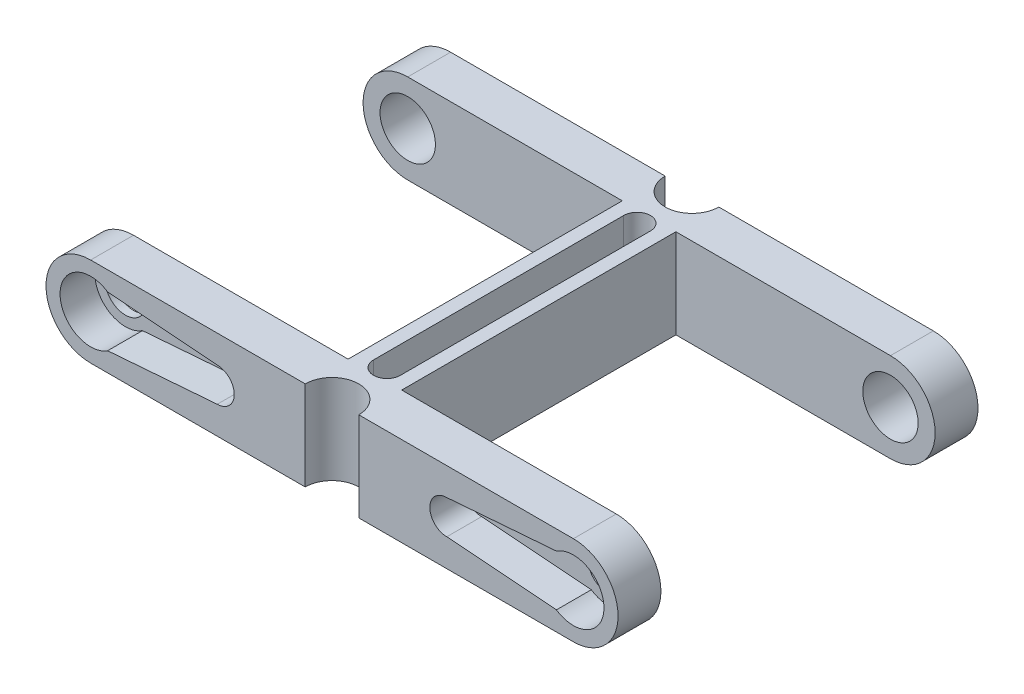
ISO-10303-21;
HEADER;
FILE_DESCRIPTION(('STEP AP214'),'2;1');
FILE_NAME('part.step','',(''),(''),'','','');
FILE_SCHEMA(('AUTOMOTIVE_DESIGN { 1 0 10303 214 1 1 1 1 }'));
ENDSEC;
DATA;
#1=APPLICATION_CONTEXT('core data for automotive mechanical design processes');
#2=APPLICATION_PROTOCOL_DEFINITION('international standard','automotive_design',2000,#1);
#3=PRODUCT_CONTEXT('',#1,'mechanical');
#4=PRODUCT('Part','Part','',(#3));
#5=PRODUCT_RELATED_PRODUCT_CATEGORY('part','',(#4));
#6=PRODUCT_DEFINITION_FORMATION('','',#4);
#7=PRODUCT_DEFINITION_CONTEXT('part definition',#1,'design');
#8=PRODUCT_DEFINITION('design','',#6,#7);
#9=PRODUCT_DEFINITION_SHAPE('','',#8);
#10=(LENGTH_UNIT() NAMED_UNIT(*) SI_UNIT(.MILLI.,.METRE.));
#11=(NAMED_UNIT(*) PLANE_ANGLE_UNIT() SI_UNIT($,.RADIAN.));
#12=(NAMED_UNIT(*) SI_UNIT($,.STERADIAN.) SOLID_ANGLE_UNIT());
#13=UNCERTAINTY_MEASURE_WITH_UNIT(LENGTH_MEASURE(1.E-05),#10,'distance_accuracy_value','');
#14=(GEOMETRIC_REPRESENTATION_CONTEXT(3) GLOBAL_UNCERTAINTY_ASSIGNED_CONTEXT((#13)) GLOBAL_UNIT_ASSIGNED_CONTEXT((#10,
#11,#12)) REPRESENTATION_CONTEXT('',''));
#15=CARTESIAN_POINT('',(0.,0.,0.));
#16=DIRECTION('',(0.,0.,1.));
#17=DIRECTION('',(1.,0.,0.));
#18=AXIS2_PLACEMENT_3D('',#15,#16,#17);
#19=CARTESIAN_POINT('',(-27.0232558139535,0.,20.15));
#20=DIRECTION('',(0.,0.,-1.));
#21=DIRECTION('',(-1.,0.,0.));
#22=AXIS2_PLACEMENT_3D('',#19,#20,#21);
#23=CYLINDRICAL_SURFACE('',#22,5.00000000000002);
#24=DIRECTION('',(0.,0.,-1.));
#25=VECTOR('',#24,1.);
#26=CARTESIAN_POINT('',(-27.0232558139535,5.00000000000001,20.15));
#27=LINE('',#26,#25);
#28=CARTESIAN_POINT('',(-27.0232558139535,5.00000000000001,20.15));
#29=VERTEX_POINT('',#28);
#30=CARTESIAN_POINT('',(-27.0232558139535,5.00000000000001,15.35));
#31=VERTEX_POINT('',#30);
#32=EDGE_CURVE('E459',#29,#31,#27,.T.);
#33=ORIENTED_EDGE('',*,*,#32,.T.);
#34=CARTESIAN_POINT('',(-27.0232558139535,0.,15.35));
#35=DIRECTION('',(0.,0.,1.));
#36=DIRECTION('',(1.,0.,0.));
#37=AXIS2_PLACEMENT_3D('',#34,#35,#36);
#38=CIRCLE('',#37,5.00000000000002);
#39=CARTESIAN_POINT('',(-27.0232558139535,-5.00000000000004,15.35));
#40=VERTEX_POINT('',#39);
#41=EDGE_CURVE('E419',#31,#40,#38,.T.);
#42=ORIENTED_EDGE('',*,*,#41,.T.);
#43=DIRECTION('',(0.,0.,-1.));
#44=VECTOR('',#43,1.);
#45=CARTESIAN_POINT('',(-27.0232558139535,-5.00000000000002,20.15));
#46=LINE('',#45,#44);
#47=CARTESIAN_POINT('',(-27.0232558139535,-5.00000000000002,20.15));
#48=VERTEX_POINT('',#47);
#49=EDGE_CURVE('E474',#48,#40,#46,.T.);
#50=ORIENTED_EDGE('',*,*,#49,.F.);
#51=CARTESIAN_POINT('',(-27.0232558139535,0.,20.15));
#52=DIRECTION('',(0.,0.,1.));
#53=DIRECTION('',(1.,0.,0.));
#54=AXIS2_PLACEMENT_3D('',#51,#52,#53);
#55=CIRCLE('',#54,5.00000000000002);
#56=EDGE_CURVE('E424',#29,#48,#55,.T.);
#57=ORIENTED_EDGE('',*,*,#56,.F.);
#58=EDGE_LOOP('',(#33,#42,#50,#57));
#59=FACE_BOUND('',#58,.T.);
#60=ADVANCED_FACE('F39',(#59),#23,.T.);
#61=CARTESIAN_POINT('',(27.0232558139535,0.,20.15));
#62=DIRECTION('',(0.,0.,-1.));
#63=DIRECTION('',(-1.,0.,0.));
#64=AXIS2_PLACEMENT_3D('',#61,#62,#63);
#65=CYLINDRICAL_SURFACE('',#64,5.00000000000002);
#66=DIRECTION('',(0.,0.,-1.));
#67=VECTOR('',#66,1.);
#68=CARTESIAN_POINT('',(27.0232558139535,5.00000000000002,20.15));
#69=LINE('',#68,#67);
#70=CARTESIAN_POINT('',(27.0232558139535,5.00000000000002,-15.35));
#71=VERTEX_POINT('',#70);
#72=CARTESIAN_POINT('',(27.0232558139535,5.00000000000002,-20.15));
#73=VERTEX_POINT('',#72);
#74=EDGE_CURVE('E463',#71,#73,#69,.T.);
#75=ORIENTED_EDGE('',*,*,#74,.F.);
#76=CARTESIAN_POINT('',(27.0232558139535,0.,-15.35));
#77=DIRECTION('',(0.,0.,-1.));
#78=DIRECTION('',(-1.,0.,0.));
#79=AXIS2_PLACEMENT_3D('',#76,#77,#78);
#80=CIRCLE('',#79,5.00000000000002);
#81=CARTESIAN_POINT('',(27.0232558139535,-5.00000000000003,-15.35));
#82=VERTEX_POINT('',#81);
#83=EDGE_CURVE('E411',#71,#82,#80,.T.);
#84=ORIENTED_EDGE('',*,*,#83,.T.);
#85=DIRECTION('',(0.,0.,-1.));
#86=VECTOR('',#85,1.);
#87=CARTESIAN_POINT('',(27.0232558139535,-5.00000000000002,20.15));
#88=LINE('',#87,#86);
#89=CARTESIAN_POINT('',(27.0232558139535,-5.00000000000002,-20.15));
#90=VERTEX_POINT('',#89);
#91=EDGE_CURVE('E468',#82,#90,#88,.T.);
#92=ORIENTED_EDGE('',*,*,#91,.T.);
#93=CARTESIAN_POINT('',(27.0232558139535,0.,-20.15));
#94=DIRECTION('',(0.,0.,1.));
#95=DIRECTION('',(1.,0.,0.));
#96=AXIS2_PLACEMENT_3D('',#93,#94,#95);
#97=CIRCLE('',#96,5.00000000000002);
#98=EDGE_CURVE('E451',#90,#73,#97,.T.);
#99=ORIENTED_EDGE('',*,*,#98,.T.);
#100=EDGE_LOOP('',(#75,#84,#92,#99));
#101=FACE_BOUND('',#100,.T.);
#102=ADVANCED_FACE('F550',(#101),#65,.T.);
#103=CARTESIAN_POINT('',(-27.0232558139535,0.,20.15));
#104=DIRECTION('',(0.,0.,1.));
#105=DIRECTION('',(1.,0.,0.));
#106=AXIS2_PLACEMENT_3D('',#103,#104,#105);
#107=PLANE('',#106);
#108=CARTESIAN_POINT('',(12.8482558139535,0.,20.15));
#109=DIRECTION('',(0.,0.,1.));
#110=DIRECTION('',(1.,0.,0.));
#111=AXIS2_PLACEMENT_3D('',#108,#109,#110);
#112=CIRCLE('',#111,1.9);
#113=CARTESIAN_POINT('',(12.8482558139535,1.9,20.15));
#114=VERTEX_POINT('',#113);
#115=CARTESIAN_POINT('',(12.8482558139535,-1.9,20.15));
#116=VERTEX_POINT('',#115);
#117=EDGE_CURVE('E57',#114,#116,#112,.T.);
#118=ORIENTED_EDGE('',*,*,#117,.F.);
#119=DIRECTION('',(-0.997018781415782,-0.0771592476906667,0.));
#120=VECTOR('',#119,1.);
#121=CARTESIAN_POINT('',(25.1237492990923,2.85,20.15));
#122=LINE('',#121,#120);
#123=CARTESIAN_POINT('',(25.1237492990923,2.85,20.15));
#124=VERTEX_POINT('',#123);
#125=EDGE_CURVE('E250',#124,#114,#122,.T.);
#126=ORIENTED_EDGE('',*,*,#125,.F.);
#127=CARTESIAN_POINT('',(27.0232558139535,0.,20.15));
#128=DIRECTION('',(0.,0.,1.));
#129=DIRECTION('',(1.,0.,0.));
#130=AXIS2_PLACEMENT_3D('',#127,#128,#129);
#131=CIRCLE('',#130,3.425);
#132=CARTESIAN_POINT('',(25.1237492990923,-2.85,20.15));
#133=VERTEX_POINT('',#132);
#134=EDGE_CURVE('E254',#133,#124,#131,.T.);
#135=ORIENTED_EDGE('',*,*,#134,.F.);
#136=DIRECTION('',(0.997018781415782,-0.0771592476906667,0.));
#137=VECTOR('',#136,1.);
#138=CARTESIAN_POINT('',(12.8482558139535,-1.9,20.15));
#139=LINE('',#138,#137);
#140=EDGE_CURVE('E266',#116,#133,#139,.T.);
#141=ORIENTED_EDGE('',*,*,#140,.F.);
#142=EDGE_LOOP('',(#118,#126,#135,#141));
#143=FACE_BOUND('',#142,.T.);
#144=DIRECTION('',(0.,1.,0.));
#145=VECTOR('',#144,1.);
#146=CARTESIAN_POINT('',(3.,-5.00000000000003,20.15));
#147=LINE('',#146,#145);
#148=CARTESIAN_POINT('',(3.,-5.00000000000003,20.15));
#149=VERTEX_POINT('',#148);
#150=CARTESIAN_POINT('',(3.,5.00000000000001,20.15));
#151=VERTEX_POINT('',#150);
#152=EDGE_CURVE('E489',#149,#151,#147,.T.);
#153=ORIENTED_EDGE('',*,*,#152,.F.);
#154=DIRECTION('',(1.,0.,0.));
#155=VECTOR('',#154,1.);
#156=CARTESIAN_POINT('',(-27.0232558139535,-5.00000000000002,20.15));
#157=LINE('',#156,#155);
#158=CARTESIAN_POINT('',(27.0232558139535,-5.00000000000002,20.15));
#159=VERTEX_POINT('',#158);
#160=EDGE_CURVE('E428',#149,#159,#157,.T.);
#161=ORIENTED_EDGE('',*,*,#160,.T.);
#162=CARTESIAN_POINT('',(27.0232558139535,0.,20.15));
#163=DIRECTION('',(0.,0.,1.));
#164=DIRECTION('',(1.,0.,0.));
#165=AXIS2_PLACEMENT_3D('',#162,#163,#164);
#166=CIRCLE('',#165,5.00000000000002);
#167=CARTESIAN_POINT('',(27.0232558139535,5.00000000000002,20.15));
#168=VERTEX_POINT('',#167);
#169=EDGE_CURVE('E434',#159,#168,#166,.T.);
#170=ORIENTED_EDGE('',*,*,#169,.T.);
#171=DIRECTION('',(-1.,0.,0.));
#172=VECTOR('',#171,1.);
#173=CARTESIAN_POINT('',(-27.0232558139535,5.00000000000001,20.15));
#174=LINE('',#173,#172);
#175=EDGE_CURVE('E438',#168,#151,#174,.T.);
#176=ORIENTED_EDGE('',*,*,#175,.T.);
#177=EDGE_LOOP('',(#153,#161,#170,#176));
#178=FACE_BOUND('',#177,.T.);
#179=ADVANCED_FACE('F558',(#143,#178),#107,.T.);
#180=CARTESIAN_POINT('',(-27.0232558139535,0.,-20.15));
#181=DIRECTION('',(0.,0.,1.));
#182=DIRECTION('',(1.,0.,0.));
#183=AXIS2_PLACEMENT_3D('',#180,#181,#182);
#184=PLANE('',#183);
#185=CARTESIAN_POINT('',(27.0232558139535,0.,-20.15));
#186=DIRECTION('',(0.,0.,-1.));
#187=DIRECTION('',(-1.,0.,0.));
#188=AXIS2_PLACEMENT_3D('',#185,#186,#187);
#189=CIRCLE('',#188,3.1);
#190=CARTESIAN_POINT('',(23.9232558139535,0.,-20.15));
#191=VERTEX_POINT('',#190);
#192=EDGE_CURVE('E946',#191,#191,#189,.T.);
#193=ORIENTED_EDGE('',*,*,#192,.F.);
#194=EDGE_LOOP('',(#193));
#195=FACE_BOUND('',#194,.T.);
#196=DIRECTION('',(1.,0.,0.));
#197=VECTOR('',#196,1.);
#198=CARTESIAN_POINT('',(-27.0232558139535,-5.00000000000002,-20.15));
#199=LINE('',#198,#197);
#200=CARTESIAN_POINT('',(3.,-5.00000000000003,-20.15));
#201=VERTEX_POINT('',#200);
#202=EDGE_CURVE('E446',#201,#90,#199,.T.);
#203=ORIENTED_EDGE('',*,*,#202,.F.);
#204=DIRECTION('',(0.,1.,0.));
#205=VECTOR('',#204,1.);
#206=CARTESIAN_POINT('',(3.,-5.00000000000003,-20.15));
#207=LINE('',#206,#205);
#208=CARTESIAN_POINT('',(3.,5.00000000000001,-20.15));
#209=VERTEX_POINT('',#208);
#210=EDGE_CURVE('E482',#201,#209,#207,.T.);
#211=ORIENTED_EDGE('',*,*,#210,.T.);
#212=DIRECTION('',(-1.,0.,0.));
#213=VECTOR('',#212,1.);
#214=CARTESIAN_POINT('',(-27.0232558139535,5.00000000000001,-20.15));
#215=LINE('',#214,#213);
#216=EDGE_CURVE('E429',#73,#209,#215,.T.);
#217=ORIENTED_EDGE('',*,*,#216,.F.);
#218=ORIENTED_EDGE('',*,*,#98,.F.);
#219=EDGE_LOOP('',(#203,#211,#217,#218));
#220=FACE_BOUND('',#219,.T.);
#221=ADVANCED_FACE('F551',(#195,#220),#184,.F.);
#222=CARTESIAN_POINT('',(-27.0232558139535,-5.00000000000004,-15.35));
#223=VERTEX_POINT('',#222);
#224=CARTESIAN_POINT('',(-27.0232558139535,-5.00000000000002,-20.15));
#225=VERTEX_POINT('',#224);
#226=EDGE_CURVE('E473',#223,#225,#46,.T.);
#227=ORIENTED_EDGE('',*,*,#226,.F.);
#228=CARTESIAN_POINT('',(-27.0232558139535,0.,-15.35));
#229=DIRECTION('',(0.,0.,-1.));
#230=DIRECTION('',(-1.,0.,0.));
#231=AXIS2_PLACEMENT_3D('',#228,#229,#230);
#232=CIRCLE('',#231,5.00000000000002);
#233=CARTESIAN_POINT('',(-27.0232558139535,5.00000000000001,-15.35));
#234=VERTEX_POINT('',#233);
#235=EDGE_CURVE('E415',#223,#234,#232,.T.);
#236=ORIENTED_EDGE('',*,*,#235,.T.);
#237=CARTESIAN_POINT('',(-27.0232558139535,5.00000000000001,-20.15));
#238=VERTEX_POINT('',#237);
#239=EDGE_CURVE('E442',#234,#238,#27,.T.);
#240=ORIENTED_EDGE('',*,*,#239,.T.);
#241=CARTESIAN_POINT('',(-27.0232558139535,0.,-20.15));
#242=DIRECTION('',(0.,0.,1.));
#243=DIRECTION('',(1.,0.,0.));
#244=AXIS2_PLACEMENT_3D('',#241,#242,#243);
#245=CIRCLE('',#244,5.00000000000002);
#246=EDGE_CURVE('E423',#238,#225,#245,.T.);
#247=ORIENTED_EDGE('',*,*,#246,.T.);
#248=EDGE_LOOP('',(#227,#236,#240,#247));
#249=FACE_BOUND('',#248,.T.);
#250=ADVANCED_FACE('F41',(#249),#23,.T.);
#251=CARTESIAN_POINT('',(-27.0232558139535,-5.00000000000002,20.15));
#252=DIRECTION('',(0.,1.,0.));
#253=DIRECTION('',(-1.,0.,0.));
#254=AXIS2_PLACEMENT_3D('',#251,#252,#253);
#255=PLANE('',#254);
#256=CARTESIAN_POINT('',(-3.,-5.00000000000002,-20.15));
#257=VERTEX_POINT('',#256);
#258=EDGE_CURVE('E447',#225,#257,#199,.T.);
#259=ORIENTED_EDGE('',*,*,#258,.T.);
#260=CARTESIAN_POINT('',(0.,-5.00000000000003,-20.15));
#261=DIRECTION('',(0.,1.,0.));
#262=DIRECTION('',(-1.,0.,0.));
#263=AXIS2_PLACEMENT_3D('',#260,#261,#262);
#264=CIRCLE('',#263,3.);
#265=EDGE_CURVE('E346',#257,#201,#264,.T.);
#266=ORIENTED_EDGE('',*,*,#265,.T.);
#267=ORIENTED_EDGE('',*,*,#202,.T.);
#268=ORIENTED_EDGE('',*,*,#91,.F.);
#269=DIRECTION('',(-1.,0.,0.));
#270=VECTOR('',#269,1.);
#271=CARTESIAN_POINT('',(27.0232558139535,-5.00000000000003,-15.35));
#272=LINE('',#271,#270);
#273=CARTESIAN_POINT('',(3.,-5.00000000000003,-15.35));
#274=VERTEX_POINT('',#273);
#275=EDGE_CURVE('E323',#82,#274,#272,.T.);
#276=ORIENTED_EDGE('',*,*,#275,.T.);
#277=DIRECTION('',(0.,0.,1.));
#278=VECTOR('',#277,1.);
#279=CARTESIAN_POINT('',(3.,-5.00000000000003,-15.35));
#280=LINE('',#279,#278);
#281=CARTESIAN_POINT('',(3.,-5.00000000000003,15.35));
#282=VERTEX_POINT('',#281);
#283=EDGE_CURVE('E327',#274,#282,#280,.T.);
#284=ORIENTED_EDGE('',*,*,#283,.T.);
#285=DIRECTION('',(1.,0.,0.));
#286=VECTOR('',#285,1.);
#287=CARTESIAN_POINT('',(3.,-5.00000000000003,15.35));
#288=LINE('',#287,#286);
#289=CARTESIAN_POINT('',(27.0232558139535,-5.00000000000003,15.35));
#290=VERTEX_POINT('',#289);
#291=EDGE_CURVE('E331',#282,#290,#288,.T.);
#292=ORIENTED_EDGE('',*,*,#291,.T.);
#293=EDGE_CURVE('E469',#159,#290,#88,.T.);
#294=ORIENTED_EDGE('',*,*,#293,.F.);
#295=ORIENTED_EDGE('',*,*,#160,.F.);
#296=CARTESIAN_POINT('',(0.,-5.00000000000003,20.15));
#297=DIRECTION('',(0.,1.,0.));
#298=DIRECTION('',(1.,0.,0.));
#299=AXIS2_PLACEMENT_3D('',#296,#297,#298);
#300=CIRCLE('',#299,3.);
#301=CARTESIAN_POINT('',(-3.,-5.00000000000003,20.15));
#302=VERTEX_POINT('',#301);
#303=EDGE_CURVE('E276',#149,#302,#300,.T.);
#304=ORIENTED_EDGE('',*,*,#303,.T.);
#305=EDGE_CURVE('E430',#48,#302,#157,.T.);
#306=ORIENTED_EDGE('',*,*,#305,.F.);
#307=ORIENTED_EDGE('',*,*,#49,.T.);
#308=DIRECTION('',(1.,0.,0.));
#309=VECTOR('',#308,1.);
#310=CARTESIAN_POINT('',(-2.99999999999999,-5.00000000000003,15.35));
#311=LINE('',#310,#309);
#312=CARTESIAN_POINT('',(-2.99999999999999,-5.00000000000003,15.35));
#313=VERTEX_POINT('',#312);
#314=EDGE_CURVE('E340',#40,#313,#311,.T.);
#315=ORIENTED_EDGE('',*,*,#314,.T.);
#316=DIRECTION('',(0.,0.,-1.));
#317=VECTOR('',#316,1.);
#318=CARTESIAN_POINT('',(-2.99999999999999,-5.00000000000003,-15.35));
#319=LINE('',#318,#317);
#320=CARTESIAN_POINT('',(-2.99999999999999,-5.00000000000003,-15.35));
#321=VERTEX_POINT('',#320);
#322=EDGE_CURVE('E355',#313,#321,#319,.T.);
#323=ORIENTED_EDGE('',*,*,#322,.T.);
#324=DIRECTION('',(-1.,0.,0.));
#325=VECTOR('',#324,1.);
#326=CARTESIAN_POINT('',(-27.0232558139535,-5.00000000000004,-15.35));
#327=LINE('',#326,#325);
#328=EDGE_CURVE('E359',#321,#223,#327,.T.);
#329=ORIENTED_EDGE('',*,*,#328,.T.);
#330=ORIENTED_EDGE('',*,*,#226,.T.);
#331=EDGE_LOOP('',(#259,#266,#267,#268,#276,#284,#292,#294,#295,#304,#306,#307,#315,#323,#329,#330));
#332=FACE_BOUND('',#331,.T.);
#333=DIRECTION('',(0.,0.,1.));
#334=VECTOR('',#333,1.);
#335=CARTESIAN_POINT('',(-1.5,-5.00000000000003,14.));
#336=LINE('',#335,#334);
#337=CARTESIAN_POINT('',(-1.5,-5.00000000000003,-14.));
#338=VERTEX_POINT('',#337);
#339=CARTESIAN_POINT('',(-1.5,-5.00000000000003,14.));
#340=VERTEX_POINT('',#339);
#341=EDGE_CURVE('E380',#338,#340,#336,.T.);
#342=ORIENTED_EDGE('',*,*,#341,.T.);
#343=CARTESIAN_POINT('',(0.,-5.00000000000003,14.));
#344=DIRECTION('',(0.,1.,0.));
#345=DIRECTION('',(-1.,0.,0.));
#346=AXIS2_PLACEMENT_3D('',#343,#344,#345);
#347=CIRCLE('',#346,1.5);
#348=CARTESIAN_POINT('',(1.5,-5.00000000000003,14.));
#349=VERTEX_POINT('',#348);
#350=EDGE_CURVE('E350',#340,#349,#347,.T.);
#351=ORIENTED_EDGE('',*,*,#350,.T.);
#352=DIRECTION('',(0.,0.,-1.));
#353=VECTOR('',#352,1.);
#354=CARTESIAN_POINT('',(1.5,-5.00000000000003,14.));
#355=LINE('',#354,#353);
#356=CARTESIAN_POINT('',(1.5,-5.00000000000002,-14.));
#357=VERTEX_POINT('',#356);
#358=EDGE_CURVE('E372',#349,#357,#355,.T.);
#359=ORIENTED_EDGE('',*,*,#358,.T.);
#360=CARTESIAN_POINT('',(0.,-5.00000000000003,-14.));
#361=DIRECTION('',(0.,1.,0.));
#362=DIRECTION('',(-1.,0.,0.));
#363=AXIS2_PLACEMENT_3D('',#360,#361,#362);
#364=CIRCLE('',#363,1.5);
#365=EDGE_CURVE('E376',#357,#338,#364,.T.);
#366=ORIENTED_EDGE('',*,*,#365,.T.);
#367=EDGE_LOOP('',(#342,#351,#359,#366));
#368=FACE_BOUND('',#367,.T.);
#369=ADVANCED_FACE('F540',(#332,#368),#255,.F.);
#370=ORIENTED_EDGE('',*,*,#293,.T.);
#371=CARTESIAN_POINT('',(27.0232558139535,0.,15.35));
#372=DIRECTION('',(0.,0.,1.));
#373=DIRECTION('',(1.,0.,0.));
#374=AXIS2_PLACEMENT_3D('',#371,#372,#373);
#375=CIRCLE('',#374,5.00000000000002);
#376=CARTESIAN_POINT('',(27.0232558139535,5.00000000000002,15.35));
#377=VERTEX_POINT('',#376);
#378=EDGE_CURVE('E407',#290,#377,#375,.T.);
#379=ORIENTED_EDGE('',*,*,#378,.T.);
#380=EDGE_CURVE('E464',#168,#377,#69,.T.);
#381=ORIENTED_EDGE('',*,*,#380,.F.);
#382=ORIENTED_EDGE('',*,*,#169,.F.);
#383=EDGE_LOOP('',(#370,#379,#381,#382));
#384=FACE_BOUND('',#383,.T.);
#385=ADVANCED_FACE('F542',(#384),#65,.T.);
#386=CARTESIAN_POINT('',(-27.0232558139535,5.00000000000001,20.15));
#387=DIRECTION('',(0.,-1.,0.));
#388=DIRECTION('',(1.,0.,0.));
#389=AXIS2_PLACEMENT_3D('',#386,#387,#388);
#390=PLANE('',#389);
#391=DIRECTION('',(0.,0.,1.));
#392=VECTOR('',#391,1.);
#393=CARTESIAN_POINT('',(1.49999999999999,5.00000000000001,20.15));
#394=LINE('',#393,#392);
#395=CARTESIAN_POINT('',(1.49999999999999,5.00000000000001,-14.));
#396=VERTEX_POINT('',#395);
#397=CARTESIAN_POINT('',(1.5,5.00000000000001,14.));
#398=VERTEX_POINT('',#397);
#399=EDGE_CURVE('E492',#396,#398,#394,.T.);
#400=ORIENTED_EDGE('',*,*,#399,.T.);
#401=CARTESIAN_POINT('',(0.,5.00000000000001,14.));
#402=DIRECTION('',(0.,1.,0.));
#403=DIRECTION('',(-1.,0.,0.));
#404=AXIS2_PLACEMENT_3D('',#401,#402,#403);
#405=CIRCLE('',#404,1.5);
#406=CARTESIAN_POINT('',(-1.5,5.00000000000001,14.));
#407=VERTEX_POINT('',#406);
#408=EDGE_CURVE('E43',#398,#407,#405,.F.);
#409=ORIENTED_EDGE('',*,*,#408,.T.);
#410=DIRECTION('',(0.,0.,1.));
#411=VECTOR('',#410,1.);
#412=CARTESIAN_POINT('',(-1.5,5.00000000000001,20.15));
#413=LINE('',#412,#411);
#414=CARTESIAN_POINT('',(-1.5,5.00000000000001,-14.));
#415=VERTEX_POINT('',#414);
#416=EDGE_CURVE('E518',#407,#415,#413,.F.);
#417=ORIENTED_EDGE('',*,*,#416,.T.);
#418=CARTESIAN_POINT('',(0.,5.00000000000001,-14.));
#419=DIRECTION('',(0.,1.,0.));
#420=DIRECTION('',(-1.,0.,0.));
#421=AXIS2_PLACEMENT_3D('',#418,#419,#420);
#422=CIRCLE('',#421,1.5);
#423=EDGE_CURVE('E515',#415,#396,#422,.F.);
#424=ORIENTED_EDGE('',*,*,#423,.T.);
#425=EDGE_LOOP('',(#400,#409,#417,#424));
#426=FACE_BOUND('',#425,.T.);
#427=ORIENTED_EDGE('',*,*,#216,.T.);
#428=CARTESIAN_POINT('',(0.,5.00000000000001,-20.15));
#429=DIRECTION('',(0.,-1.,0.));
#430=DIRECTION('',(1.,0.,0.));
#431=AXIS2_PLACEMENT_3D('',#428,#429,#430);
#432=CIRCLE('',#431,3.);
#433=CARTESIAN_POINT('',(-3.,5.00000000000002,-20.15));
#434=VERTEX_POINT('',#433);
#435=EDGE_CURVE('E394',#209,#434,#432,.T.);
#436=ORIENTED_EDGE('',*,*,#435,.T.);
#437=EDGE_CURVE('E455',#434,#238,#215,.T.);
#438=ORIENTED_EDGE('',*,*,#437,.T.);
#439=ORIENTED_EDGE('',*,*,#239,.F.);
#440=DIRECTION('',(1.,0.,0.));
#441=VECTOR('',#440,1.);
#442=CARTESIAN_POINT('',(-27.0232558139535,5.00000000000001,-15.35));
#443=LINE('',#442,#441);
#444=CARTESIAN_POINT('',(-3.,5.00000000000001,-15.35));
#445=VERTEX_POINT('',#444);
#446=EDGE_CURVE('E49',#234,#445,#443,.T.);
#447=ORIENTED_EDGE('',*,*,#446,.T.);
#448=DIRECTION('',(0.,0.,1.));
#449=VECTOR('',#448,1.);
#450=CARTESIAN_POINT('',(-3.,5.00000000000001,20.15));
#451=LINE('',#450,#449);
#452=CARTESIAN_POINT('',(-3.,5.00000000000001,15.35));
#453=VERTEX_POINT('',#452);
#454=EDGE_CURVE('E505',#445,#453,#451,.T.);
#455=ORIENTED_EDGE('',*,*,#454,.T.);
#456=DIRECTION('',(-1.,0.,0.));
#457=VECTOR('',#456,1.);
#458=CARTESIAN_POINT('',(-27.0232558139535,5.00000000000001,15.35));
#459=LINE('',#458,#457);
#460=EDGE_CURVE('E11',#453,#31,#459,.T.);
#461=ORIENTED_EDGE('',*,*,#460,.T.);
#462=ORIENTED_EDGE('',*,*,#32,.F.);
#463=CARTESIAN_POINT('',(-3.,5.00000000000001,20.15));
#464=VERTEX_POINT('',#463);
#465=EDGE_CURVE('E437',#464,#29,#174,.T.);
#466=ORIENTED_EDGE('',*,*,#465,.F.);
#467=CARTESIAN_POINT('',(0.,5.00000000000001,20.15));
#468=DIRECTION('',(0.,-1.,0.));
#469=DIRECTION('',(1.,0.,0.));
#470=AXIS2_PLACEMENT_3D('',#467,#468,#469);
#471=CIRCLE('',#470,3.);
#472=EDGE_CURVE('E403',#464,#151,#471,.T.);
#473=ORIENTED_EDGE('',*,*,#472,.T.);
#474=ORIENTED_EDGE('',*,*,#175,.F.);
#475=ORIENTED_EDGE('',*,*,#380,.T.);
#476=DIRECTION('',(-1.,0.,0.));
#477=VECTOR('',#476,1.);
#478=CARTESIAN_POINT('',(-27.0232558139535,5.00000000000001,15.35));
#479=LINE('',#478,#477);
#480=CARTESIAN_POINT('',(2.99999999999999,5.00000000000001,15.35));
#481=VERTEX_POINT('',#480);
#482=EDGE_CURVE('E497',#377,#481,#479,.T.);
#483=ORIENTED_EDGE('',*,*,#482,.T.);
#484=DIRECTION('',(0.,0.,-1.));
#485=VECTOR('',#484,1.);
#486=CARTESIAN_POINT('',(2.99999999999999,5.00000000000001,20.15));
#487=LINE('',#486,#485);
#488=CARTESIAN_POINT('',(2.99999999999999,5.00000000000001,-15.35));
#489=VERTEX_POINT('',#488);
#490=EDGE_CURVE('E493',#481,#489,#487,.T.);
#491=ORIENTED_EDGE('',*,*,#490,.T.);
#492=DIRECTION('',(1.,0.,0.));
#493=VECTOR('',#492,1.);
#494=CARTESIAN_POINT('',(-27.0232558139535,5.00000000000001,-15.35));
#495=LINE('',#494,#493);
#496=EDGE_CURVE('E501',#489,#71,#495,.T.);
#497=ORIENTED_EDGE('',*,*,#496,.T.);
#498=ORIENTED_EDGE('',*,*,#74,.T.);
#499=EDGE_LOOP('',(#427,#436,#438,#439,#447,#455,#461,#462,#466,#473,#474,#475,#483,#491,#497,#498));
#500=FACE_BOUND('',#499,.T.);
#501=ADVANCED_FACE('F525',(#426,#500),#390,.F.);
#502=CARTESIAN_POINT('',(-12.8482558139535,0.,20.15));
#503=DIRECTION('',(0.,0.,1.));
#504=DIRECTION('',(-1.,0.,0.));
#505=AXIS2_PLACEMENT_3D('',#502,#503,#504);
#506=CIRCLE('',#505,1.9);
#507=CARTESIAN_POINT('',(-12.8482558139535,-1.9,20.15));
#508=VERTEX_POINT('',#507);
#509=CARTESIAN_POINT('',(-12.8482558139535,1.9,20.15));
#510=VERTEX_POINT('',#509);
#511=EDGE_CURVE('E65',#508,#510,#506,.T.);
#512=ORIENTED_EDGE('',*,*,#511,.F.);
#513=DIRECTION('',(0.997018781415782,0.0771592476906667,0.));
#514=VECTOR('',#513,1.);
#515=CARTESIAN_POINT('',(-12.8482558139535,-1.9,20.15));
#516=LINE('',#515,#514);
#517=CARTESIAN_POINT('',(-25.1237492990923,-2.85,20.15));
#518=VERTEX_POINT('',#517);
#519=EDGE_CURVE('E287',#518,#508,#516,.T.);
#520=ORIENTED_EDGE('',*,*,#519,.F.);
#521=CARTESIAN_POINT('',(-27.0232558139535,0.,20.15));
#522=DIRECTION('',(0.,0.,1.));
#523=DIRECTION('',(-1.,0.,0.));
#524=AXIS2_PLACEMENT_3D('',#521,#522,#523);
#525=CIRCLE('',#524,3.425);
#526=CARTESIAN_POINT('',(-25.1237492990923,2.85,20.15));
#527=VERTEX_POINT('',#526);
#528=EDGE_CURVE('E306',#527,#518,#525,.T.);
#529=ORIENTED_EDGE('',*,*,#528,.F.);
#530=DIRECTION('',(-0.997018781415782,0.0771592476906667,0.));
#531=VECTOR('',#530,1.);
#532=CARTESIAN_POINT('',(-25.1237492990923,2.85,20.15));
#533=LINE('',#532,#531);
#534=EDGE_CURVE('E302',#510,#527,#533,.T.);
#535=ORIENTED_EDGE('',*,*,#534,.F.);
#536=EDGE_LOOP('',(#512,#520,#529,#535));
#537=FACE_BOUND('',#536,.T.);
#538=DIRECTION('',(0.,1.,0.));
#539=VECTOR('',#538,1.);
#540=CARTESIAN_POINT('',(-3.,-5.00000000000003,20.15));
#541=LINE('',#540,#539);
#542=EDGE_CURVE('E486',#464,#302,#541,.F.);
#543=ORIENTED_EDGE('',*,*,#542,.F.);
#544=ORIENTED_EDGE('',*,*,#465,.T.);
#545=ORIENTED_EDGE('',*,*,#56,.T.);
#546=ORIENTED_EDGE('',*,*,#305,.T.);
#547=EDGE_LOOP('',(#543,#544,#545,#546));
#548=FACE_BOUND('',#547,.T.);
#549=ADVANCED_FACE('F571',(#537,#548),#107,.T.);
#550=CARTESIAN_POINT('',(-27.0232558139535,0.,-20.15));
#551=DIRECTION('',(0.,0.,-1.));
#552=DIRECTION('',(-1.,0.,0.));
#553=AXIS2_PLACEMENT_3D('',#550,#551,#552);
#554=CIRCLE('',#553,3.1);
#555=CARTESIAN_POINT('',(-30.1232558139535,0.,-20.15));
#556=VERTEX_POINT('',#555);
#557=EDGE_CURVE('E957',#556,#556,#554,.T.);
#558=ORIENTED_EDGE('',*,*,#557,.F.);
#559=EDGE_LOOP('',(#558));
#560=FACE_BOUND('',#559,.T.);
#561=ORIENTED_EDGE('',*,*,#437,.F.);
#562=DIRECTION('',(0.,1.,0.));
#563=VECTOR('',#562,1.);
#564=CARTESIAN_POINT('',(-3.,-5.00000000000003,-20.15));
#565=LINE('',#564,#563);
#566=EDGE_CURVE('E478',#434,#257,#565,.F.);
#567=ORIENTED_EDGE('',*,*,#566,.T.);
#568=ORIENTED_EDGE('',*,*,#258,.F.);
#569=ORIENTED_EDGE('',*,*,#246,.F.);
#570=EDGE_LOOP('',(#561,#567,#568,#569));
#571=FACE_BOUND('',#570,.T.);
#572=ADVANCED_FACE('F594',(#560,#571),#184,.F.);
#573=CARTESIAN_POINT('',(0.,-5.00000000000003,-20.15));
#574=DIRECTION('',(0.,1.,0.));
#575=DIRECTION('',(-1.,0.,0.));
#576=AXIS2_PLACEMENT_3D('',#573,#574,#575);
#577=CYLINDRICAL_SURFACE('',#576,3.);
#578=ORIENTED_EDGE('',*,*,#265,.F.);
#579=ORIENTED_EDGE('',*,*,#566,.F.);
#580=ORIENTED_EDGE('',*,*,#435,.F.);
#581=ORIENTED_EDGE('',*,*,#210,.F.);
#582=EDGE_LOOP('',(#578,#579,#580,#581));
#583=FACE_BOUND('',#582,.T.);
#584=ADVANCED_FACE('F628',(#583),#577,.F.);
#585=CARTESIAN_POINT('',(0.,-5.00000000000003,20.15));
#586=DIRECTION('',(0.,1.,0.));
#587=DIRECTION('',(-1.,0.,0.));
#588=AXIS2_PLACEMENT_3D('',#585,#586,#587);
#589=CYLINDRICAL_SURFACE('',#588,3.);
#590=ORIENTED_EDGE('',*,*,#152,.T.);
#591=ORIENTED_EDGE('',*,*,#472,.F.);
#592=ORIENTED_EDGE('',*,*,#542,.T.);
#593=ORIENTED_EDGE('',*,*,#303,.F.);
#594=EDGE_LOOP('',(#590,#591,#592,#593));
#595=FACE_BOUND('',#594,.T.);
#596=ADVANCED_FACE('F622',(#595),#589,.F.);
#597=CARTESIAN_POINT('',(0.,-5.00000000000003,14.));
#598=DIRECTION('',(0.,1.,0.));
#599=DIRECTION('',(-1.,0.,0.));
#600=AXIS2_PLACEMENT_3D('',#597,#598,#599);
#601=CYLINDRICAL_SURFACE('',#600,1.5);
#602=DIRECTION('',(0.,1.,0.));
#603=VECTOR('',#602,1.);
#604=CARTESIAN_POINT('',(1.5,-5.00000000000003,14.));
#605=LINE('',#604,#603);
#606=EDGE_CURVE('E384',#349,#398,#605,.T.);
#607=ORIENTED_EDGE('',*,*,#606,.F.);
#608=ORIENTED_EDGE('',*,*,#350,.F.);
#609=DIRECTION('',(0.,1.,0.));
#610=VECTOR('',#609,1.);
#611=CARTESIAN_POINT('',(-1.5,-5.00000000000003,14.));
#612=LINE('',#611,#610);
#613=EDGE_CURVE('E389',#340,#407,#612,.T.);
#614=ORIENTED_EDGE('',*,*,#613,.T.);
#615=ORIENTED_EDGE('',*,*,#408,.F.);
#616=EDGE_LOOP('',(#607,#608,#614,#615));
#617=FACE_BOUND('',#616,.T.);
#618=ADVANCED_FACE('F528',(#617),#601,.F.);
#619=CARTESIAN_POINT('',(-1.5,-5.00000000000003,14.));
#620=DIRECTION('',(-1.,0.,0.));
#621=DIRECTION('',(0.,0.,1.));
#622=AXIS2_PLACEMENT_3D('',#619,#620,#621);
#623=PLANE('',#622);
#624=ORIENTED_EDGE('',*,*,#613,.F.);
#625=ORIENTED_EDGE('',*,*,#341,.F.);
#626=DIRECTION('',(0.,1.,0.));
#627=VECTOR('',#626,1.);
#628=CARTESIAN_POINT('',(-1.5,-5.00000000000003,-14.));
#629=LINE('',#628,#627);
#630=EDGE_CURVE('E385',#338,#415,#629,.T.);
#631=ORIENTED_EDGE('',*,*,#630,.T.);
#632=ORIENTED_EDGE('',*,*,#416,.F.);
#633=EDGE_LOOP('',(#624,#625,#631,#632));
#634=FACE_BOUND('',#633,.T.);
#635=ADVANCED_FACE('F533',(#634),#623,.F.);
#636=CARTESIAN_POINT('',(0.,-5.00000000000003,-14.));
#637=DIRECTION('',(0.,1.,0.));
#638=DIRECTION('',(-1.,0.,0.));
#639=AXIS2_PLACEMENT_3D('',#636,#637,#638);
#640=CYLINDRICAL_SURFACE('',#639,1.5);
#641=ORIENTED_EDGE('',*,*,#630,.F.);
#642=ORIENTED_EDGE('',*,*,#365,.F.);
#643=DIRECTION('',(0.,1.,0.));
#644=VECTOR('',#643,1.);
#645=CARTESIAN_POINT('',(1.5,-5.00000000000003,-14.));
#646=LINE('',#645,#644);
#647=EDGE_CURVE('E390',#357,#396,#646,.T.);
#648=ORIENTED_EDGE('',*,*,#647,.T.);
#649=ORIENTED_EDGE('',*,*,#423,.F.);
#650=EDGE_LOOP('',(#641,#642,#648,#649));
#651=FACE_BOUND('',#650,.T.);
#652=ADVANCED_FACE('F535',(#651),#640,.F.);
#653=CARTESIAN_POINT('',(1.5,-5.00000000000003,14.));
#654=DIRECTION('',(1.,0.,0.));
#655=DIRECTION('',(0.,0.,-1.));
#656=AXIS2_PLACEMENT_3D('',#653,#654,#655);
#657=PLANE('',#656);
#658=ORIENTED_EDGE('',*,*,#647,.F.);
#659=ORIENTED_EDGE('',*,*,#358,.F.);
#660=ORIENTED_EDGE('',*,*,#606,.T.);
#661=ORIENTED_EDGE('',*,*,#399,.F.);
#662=EDGE_LOOP('',(#658,#659,#660,#661));
#663=FACE_BOUND('',#662,.T.);
#664=ADVANCED_FACE('F538',(#663),#657,.F.);
#665=CARTESIAN_POINT('',(27.0232558139535,-5.00000000000003,-15.35));
#666=DIRECTION('',(0.,0.,-1.));
#667=DIRECTION('',(-1.,0.,0.));
#668=AXIS2_PLACEMENT_3D('',#665,#666,#667);
#669=PLANE('',#668);
#670=CARTESIAN_POINT('',(27.0232558139535,0.,-15.35));
#671=DIRECTION('',(0.,0.,-1.));
#672=DIRECTION('',(-1.,0.,0.));
#673=AXIS2_PLACEMENT_3D('',#670,#671,#672);
#674=CIRCLE('',#673,3.1);
#675=CARTESIAN_POINT('',(23.9232558139535,0.,-15.35));
#676=VERTEX_POINT('',#675);
#677=EDGE_CURVE('E949',#676,#676,#674,.T.);
#678=ORIENTED_EDGE('',*,*,#677,.T.);
#679=EDGE_LOOP('',(#678));
#680=FACE_BOUND('',#679,.T.);
#681=ORIENTED_EDGE('',*,*,#496,.F.);
#682=DIRECTION('',(0.,1.,0.));
#683=VECTOR('',#682,1.);
#684=CARTESIAN_POINT('',(3.,-5.00000000000003,-15.35));
#685=LINE('',#684,#683);
#686=EDGE_CURVE('E335',#274,#489,#685,.T.);
#687=ORIENTED_EDGE('',*,*,#686,.F.);
#688=ORIENTED_EDGE('',*,*,#275,.F.);
#689=ORIENTED_EDGE('',*,*,#83,.F.);
#690=EDGE_LOOP('',(#681,#687,#688,#689));
#691=FACE_BOUND('',#690,.T.);
#692=ADVANCED_FACE('F619',(#680,#691),#669,.F.);
#693=CARTESIAN_POINT('',(27.0232558139535,-5.00000000000003,15.35));
#694=DIRECTION('',(0.,0.,1.));
#695=DIRECTION('',(1.,0.,0.));
#696=AXIS2_PLACEMENT_3D('',#693,#694,#695);
#697=PLANE('',#696);
#698=CARTESIAN_POINT('',(27.0232558139535,0.,15.35));
#699=DIRECTION('',(0.,0.,1.));
#700=DIRECTION('',(1.,0.,0.));
#701=AXIS2_PLACEMENT_3D('',#698,#699,#700);
#702=CIRCLE('',#701,2.3);
#703=CARTESIAN_POINT('',(29.3232558139535,0.,15.35));
#704=VERTEX_POINT('',#703);
#705=EDGE_CURVE('E969',#704,#704,#702,.F.);
#706=ORIENTED_EDGE('',*,*,#705,.F.);
#707=EDGE_LOOP('',(#706));
#708=FACE_BOUND('',#707,.T.);
#709=ORIENTED_EDGE('',*,*,#291,.F.);
#710=DIRECTION('',(0.,1.,0.));
#711=VECTOR('',#710,1.);
#712=CARTESIAN_POINT('',(3.,-5.00000000000003,15.35));
#713=LINE('',#712,#711);
#714=EDGE_CURVE('E336',#282,#481,#713,.T.);
#715=ORIENTED_EDGE('',*,*,#714,.T.);
#716=ORIENTED_EDGE('',*,*,#482,.F.);
#717=ORIENTED_EDGE('',*,*,#378,.F.);
#718=EDGE_LOOP('',(#709,#715,#716,#717));
#719=FACE_BOUND('',#718,.T.);
#720=ADVANCED_FACE('F683',(#708,#719),#697,.F.);
#721=CARTESIAN_POINT('',(3.,-5.00000000000003,-15.35));
#722=DIRECTION('',(-1.,0.,0.));
#723=DIRECTION('',(0.,-1.,0.));
#724=AXIS2_PLACEMENT_3D('',#721,#722,#723);
#725=PLANE('',#724);
#726=ORIENTED_EDGE('',*,*,#714,.F.);
#727=ORIENTED_EDGE('',*,*,#283,.F.);
#728=ORIENTED_EDGE('',*,*,#686,.T.);
#729=ORIENTED_EDGE('',*,*,#490,.F.);
#730=EDGE_LOOP('',(#726,#727,#728,#729));
#731=FACE_BOUND('',#730,.T.);
#732=ADVANCED_FACE('F692',(#731),#725,.F.);
#733=CARTESIAN_POINT('',(-27.0232558139535,-5.00000000000004,15.35));
#734=DIRECTION('',(0.,0.,1.));
#735=DIRECTION('',(1.,0.,0.));
#736=AXIS2_PLACEMENT_3D('',#733,#734,#735);
#737=PLANE('',#736);
#738=CARTESIAN_POINT('',(-27.0232558139535,0.,15.35));
#739=DIRECTION('',(0.,0.,1.));
#740=DIRECTION('',(1.,0.,0.));
#741=AXIS2_PLACEMENT_3D('',#738,#739,#740);
#742=CIRCLE('',#741,2.3);
#743=CARTESIAN_POINT('',(-24.7232558139535,0.,15.35));
#744=VERTEX_POINT('',#743);
#745=EDGE_CURVE('E257',#744,#744,#742,.F.);
#746=ORIENTED_EDGE('',*,*,#745,.F.);
#747=EDGE_LOOP('',(#746));
#748=FACE_BOUND('',#747,.T.);
#749=ORIENTED_EDGE('',*,*,#460,.F.);
#750=DIRECTION('',(0.,1.,0.));
#751=VECTOR('',#750,1.);
#752=CARTESIAN_POINT('',(-2.99999999999999,-5.00000000000003,15.35));
#753=LINE('',#752,#751);
#754=EDGE_CURVE('E363',#313,#453,#753,.T.);
#755=ORIENTED_EDGE('',*,*,#754,.F.);
#756=ORIENTED_EDGE('',*,*,#314,.F.);
#757=ORIENTED_EDGE('',*,*,#41,.F.);
#758=EDGE_LOOP('',(#749,#755,#756,#757));
#759=FACE_BOUND('',#758,.T.);
#760=ADVANCED_FACE('F566',(#748,#759),#737,.F.);
#761=CARTESIAN_POINT('',(-27.0232558139535,-5.00000000000004,-15.35));
#762=DIRECTION('',(0.,0.,-1.));
#763=DIRECTION('',(-1.,0.,0.));
#764=AXIS2_PLACEMENT_3D('',#761,#762,#763);
#765=PLANE('',#764);
#766=CARTESIAN_POINT('',(-27.0232558139535,0.,-15.35));
#767=DIRECTION('',(0.,0.,-1.));
#768=DIRECTION('',(-1.,0.,0.));
#769=AXIS2_PLACEMENT_3D('',#766,#767,#768);
#770=CIRCLE('',#769,3.1);
#771=CARTESIAN_POINT('',(-30.1232558139535,0.,-15.35));
#772=VERTEX_POINT('',#771);
#773=EDGE_CURVE('E963',#772,#772,#770,.T.);
#774=ORIENTED_EDGE('',*,*,#773,.T.);
#775=EDGE_LOOP('',(#774));
#776=FACE_BOUND('',#775,.T.);
#777=ORIENTED_EDGE('',*,*,#328,.F.);
#778=DIRECTION('',(0.,1.,0.));
#779=VECTOR('',#778,1.);
#780=CARTESIAN_POINT('',(-2.99999999999999,-5.00000000000003,-15.35));
#781=LINE('',#780,#779);
#782=EDGE_CURVE('E351',#321,#445,#781,.T.);
#783=ORIENTED_EDGE('',*,*,#782,.T.);
#784=ORIENTED_EDGE('',*,*,#446,.F.);
#785=ORIENTED_EDGE('',*,*,#235,.F.);
#786=EDGE_LOOP('',(#777,#783,#784,#785));
#787=FACE_BOUND('',#786,.T.);
#788=ADVANCED_FACE('F597',(#776,#787),#765,.F.);
#789=CARTESIAN_POINT('',(-2.99999999999999,-5.00000000000003,-15.35));
#790=DIRECTION('',(1.,0.,0.));
#791=DIRECTION('',(0.,1.,0.));
#792=AXIS2_PLACEMENT_3D('',#789,#790,#791);
#793=PLANE('',#792);
#794=ORIENTED_EDGE('',*,*,#782,.F.);
#795=ORIENTED_EDGE('',*,*,#322,.F.);
#796=ORIENTED_EDGE('',*,*,#754,.T.);
#797=ORIENTED_EDGE('',*,*,#454,.F.);
#798=EDGE_LOOP('',(#794,#795,#796,#797));
#799=FACE_BOUND('',#798,.T.);
#800=ADVANCED_FACE('F599',(#799),#793,.F.);
#801=CARTESIAN_POINT('',(-12.8482558139535,0.,16.25));
#802=DIRECTION('',(0.,0.,1.));
#803=DIRECTION('',(1.,0.,0.));
#804=AXIS2_PLACEMENT_3D('',#801,#802,#803);
#805=CYLINDRICAL_SURFACE('',#804,1.9);
#806=ORIENTED_EDGE('',*,*,#511,.T.);
#807=DIRECTION('',(0.,0.,1.));
#808=VECTOR('',#807,1.);
#809=CARTESIAN_POINT('',(-12.8482558139535,1.9,16.25));
#810=LINE('',#809,#808);
#811=CARTESIAN_POINT('',(-12.8482558139535,1.9,16.25));
#812=VERTEX_POINT('',#811);
#813=EDGE_CURVE('E299',#812,#510,#810,.T.);
#814=ORIENTED_EDGE('',*,*,#813,.F.);
#815=CARTESIAN_POINT('',(-12.8482558139535,0.,16.25));
#816=DIRECTION('',(0.,0.,1.));
#817=DIRECTION('',(-1.,0.,0.));
#818=AXIS2_PLACEMENT_3D('',#815,#816,#817);
#819=CIRCLE('',#818,1.9);
#820=CARTESIAN_POINT('',(-12.8482558139535,-1.9,16.25));
#821=VERTEX_POINT('',#820);
#822=EDGE_CURVE('E282',#821,#812,#819,.T.);
#823=ORIENTED_EDGE('',*,*,#822,.F.);
#824=DIRECTION('',(0.,0.,1.));
#825=VECTOR('',#824,1.);
#826=CARTESIAN_POINT('',(-12.8482558139535,-1.9,16.25));
#827=LINE('',#826,#825);
#828=EDGE_CURVE('E267',#821,#508,#827,.T.);
#829=ORIENTED_EDGE('',*,*,#828,.T.);
#830=EDGE_LOOP('',(#806,#814,#823,#829));
#831=FACE_BOUND('',#830,.T.);
#832=ADVANCED_FACE('F601',(#831),#805,.F.);
#833=CARTESIAN_POINT('',(-12.8482558139535,-1.9,16.25));
#834=DIRECTION('',(0.0771592476906667,-0.997018781415782,0.));
#835=DIRECTION('',(0.997018781415782,0.0771592476906667,0.));
#836=AXIS2_PLACEMENT_3D('',#833,#834,#835);
#837=PLANE('',#836);
#838=ORIENTED_EDGE('',*,*,#519,.T.);
#839=ORIENTED_EDGE('',*,*,#828,.F.);
#840=DIRECTION('',(0.997018781415782,0.0771592476906667,0.));
#841=VECTOR('',#840,1.);
#842=CARTESIAN_POINT('',(-12.8482558139535,-1.9,16.25));
#843=LINE('',#842,#841);
#844=CARTESIAN_POINT('',(-25.1237492990923,-2.85,16.25));
#845=VERTEX_POINT('',#844);
#846=EDGE_CURVE('E295',#845,#821,#843,.T.);
#847=ORIENTED_EDGE('',*,*,#846,.F.);
#848=DIRECTION('',(0.,0.,1.));
#849=VECTOR('',#848,1.);
#850=CARTESIAN_POINT('',(-25.1237492990923,-2.85,16.25));
#851=LINE('',#850,#849);
#852=EDGE_CURVE('E315',#845,#518,#851,.T.);
#853=ORIENTED_EDGE('',*,*,#852,.T.);
#854=EDGE_LOOP('',(#838,#839,#847,#853));
#855=FACE_BOUND('',#854,.T.);
#856=ADVANCED_FACE('F607',(#855),#837,.F.);
#857=CARTESIAN_POINT('',(-27.0232558139535,0.,16.25));
#858=DIRECTION('',(0.,0.,1.));
#859=DIRECTION('',(1.,0.,0.));
#860=AXIS2_PLACEMENT_3D('',#857,#858,#859);
#861=CYLINDRICAL_SURFACE('',#860,3.425);
#862=ORIENTED_EDGE('',*,*,#528,.T.);
#863=ORIENTED_EDGE('',*,*,#852,.F.);
#864=CARTESIAN_POINT('',(-27.0232558139535,0.,16.25));
#865=DIRECTION('',(0.,0.,1.));
#866=DIRECTION('',(-1.,0.,0.));
#867=AXIS2_PLACEMENT_3D('',#864,#865,#866);
#868=CIRCLE('',#867,3.425);
#869=CARTESIAN_POINT('',(-25.1237492990923,2.85,16.25));
#870=VERTEX_POINT('',#869);
#871=EDGE_CURVE('E291',#870,#845,#868,.T.);
#872=ORIENTED_EDGE('',*,*,#871,.F.);
#873=DIRECTION('',(0.,0.,1.));
#874=VECTOR('',#873,1.);
#875=CARTESIAN_POINT('',(-25.1237492990923,2.85,16.25));
#876=LINE('',#875,#874);
#877=EDGE_CURVE('E318',#870,#527,#876,.T.);
#878=ORIENTED_EDGE('',*,*,#877,.T.);
#879=EDGE_LOOP('',(#862,#863,#872,#878));
#880=FACE_BOUND('',#879,.T.);
#881=ADVANCED_FACE('F771',(#880),#861,.F.);
#882=CARTESIAN_POINT('',(-25.1237492990923,2.85,16.25));
#883=DIRECTION('',(0.0771592476906667,0.997018781415782,0.));
#884=DIRECTION('',(-0.997018781415782,0.0771592476906667,0.));
#885=AXIS2_PLACEMENT_3D('',#882,#883,#884);
#886=PLANE('',#885);
#887=ORIENTED_EDGE('',*,*,#534,.T.);
#888=ORIENTED_EDGE('',*,*,#877,.F.);
#889=DIRECTION('',(-0.997018781415782,0.0771592476906667,0.));
#890=VECTOR('',#889,1.);
#891=CARTESIAN_POINT('',(-25.1237492990923,2.85,16.25));
#892=LINE('',#891,#890);
#893=EDGE_CURVE('E286',#812,#870,#892,.T.);
#894=ORIENTED_EDGE('',*,*,#893,.F.);
#895=ORIENTED_EDGE('',*,*,#813,.T.);
#896=EDGE_LOOP('',(#887,#888,#894,#895));
#897=FACE_BOUND('',#896,.T.);
#898=ADVANCED_FACE('F767',(#897),#886,.F.);
#899=CARTESIAN_POINT('',(-12.8482558139535,0.,16.25));
#900=DIRECTION('',(0.,0.,-1.));
#901=DIRECTION('',(-1.,0.,0.));
#902=AXIS2_PLACEMENT_3D('',#899,#900,#901);
#903=PLANE('',#902);
#904=CARTESIAN_POINT('',(-27.0232558139535,0.,16.25));
#905=DIRECTION('',(0.,0.,-1.));
#906=DIRECTION('',(-1.,0.,0.));
#907=AXIS2_PLACEMENT_3D('',#904,#905,#906);
#908=CIRCLE('',#907,2.3);
#909=CARTESIAN_POINT('',(-29.3232558139535,0.,16.25));
#910=VERTEX_POINT('',#909);
#911=EDGE_CURVE('E948',#910,#910,#908,.T.);
#912=ORIENTED_EDGE('',*,*,#911,.T.);
#913=EDGE_LOOP('',(#912));
#914=FACE_BOUND('',#913,.T.);
#915=ORIENTED_EDGE('',*,*,#822,.T.);
#916=ORIENTED_EDGE('',*,*,#893,.T.);
#917=ORIENTED_EDGE('',*,*,#871,.T.);
#918=ORIENTED_EDGE('',*,*,#846,.T.);
#919=EDGE_LOOP('',(#915,#916,#917,#918));
#920=FACE_BOUND('',#919,.T.);
#921=ADVANCED_FACE('F764',(#914,#920),#903,.F.);
#922=CARTESIAN_POINT('',(12.8482558139535,0.,16.25));
#923=DIRECTION('',(0.,0.,1.));
#924=DIRECTION('',(1.,0.,0.));
#925=AXIS2_PLACEMENT_3D('',#922,#923,#924);
#926=CYLINDRICAL_SURFACE('',#925,1.9);
#927=ORIENTED_EDGE('',*,*,#117,.T.);
#928=DIRECTION('',(0.,0.,1.));
#929=VECTOR('',#928,1.);
#930=CARTESIAN_POINT('',(12.8482558139535,-1.9,16.25));
#931=LINE('',#930,#929);
#932=CARTESIAN_POINT('',(12.8482558139535,-1.9,16.25));
#933=VERTEX_POINT('',#932);
#934=EDGE_CURVE('E225',#933,#116,#931,.T.);
#935=ORIENTED_EDGE('',*,*,#934,.F.);
#936=CARTESIAN_POINT('',(12.8482558139535,0.,16.25));
#937=DIRECTION('',(0.,0.,1.));
#938=DIRECTION('',(1.,0.,0.));
#939=AXIS2_PLACEMENT_3D('',#936,#937,#938);
#940=CIRCLE('',#939,1.9);
#941=CARTESIAN_POINT('',(12.8482558139535,1.9,16.25));
#942=VERTEX_POINT('',#941);
#943=EDGE_CURVE('E229',#942,#933,#940,.T.);
#944=ORIENTED_EDGE('',*,*,#943,.F.);
#945=DIRECTION('',(0.,0.,1.));
#946=VECTOR('',#945,1.);
#947=CARTESIAN_POINT('',(12.8482558139535,1.9,16.25));
#948=LINE('',#947,#946);
#949=EDGE_CURVE('E273',#942,#114,#948,.T.);
#950=ORIENTED_EDGE('',*,*,#949,.T.);
#951=EDGE_LOOP('',(#927,#935,#944,#950));
#952=FACE_BOUND('',#951,.T.);
#953=ADVANCED_FACE('F227',(#952),#926,.F.);
#954=CARTESIAN_POINT('',(25.1237492990923,2.85,16.25));
#955=DIRECTION('',(-0.0771592476906667,0.997018781415782,0.));
#956=DIRECTION('',(-0.997018781415782,-0.0771592476906667,0.));
#957=AXIS2_PLACEMENT_3D('',#954,#955,#956);
#958=PLANE('',#957);
#959=ORIENTED_EDGE('',*,*,#125,.T.);
#960=ORIENTED_EDGE('',*,*,#949,.F.);
#961=DIRECTION('',(-0.997018781415782,-0.0771592476906667,0.));
#962=VECTOR('',#961,1.);
#963=CARTESIAN_POINT('',(25.1237492990923,2.85,16.25));
#964=LINE('',#963,#962);
#965=CARTESIAN_POINT('',(25.1237492990923,2.85,16.25));
#966=VERTEX_POINT('',#965);
#967=EDGE_CURVE('E236',#966,#942,#964,.T.);
#968=ORIENTED_EDGE('',*,*,#967,.F.);
#969=DIRECTION('',(0.,0.,1.));
#970=VECTOR('',#969,1.);
#971=CARTESIAN_POINT('',(25.1237492990923,2.85,16.25));
#972=LINE('',#971,#970);
#973=EDGE_CURVE('E277',#966,#124,#972,.T.);
#974=ORIENTED_EDGE('',*,*,#973,.T.);
#975=EDGE_LOOP('',(#959,#960,#968,#974));
#976=FACE_BOUND('',#975,.T.);
#977=ADVANCED_FACE('F752',(#976),#958,.F.);
#978=CARTESIAN_POINT('',(27.0232558139535,0.,16.25));
#979=DIRECTION('',(0.,0.,1.));
#980=DIRECTION('',(1.,0.,0.));
#981=AXIS2_PLACEMENT_3D('',#978,#979,#980);
#982=CYLINDRICAL_SURFACE('',#981,3.425);
#983=ORIENTED_EDGE('',*,*,#134,.T.);
#984=ORIENTED_EDGE('',*,*,#973,.F.);
#985=CARTESIAN_POINT('',(27.0232558139535,0.,16.25));
#986=DIRECTION('',(0.,0.,1.));
#987=DIRECTION('',(1.,0.,0.));
#988=AXIS2_PLACEMENT_3D('',#985,#986,#987);
#989=CIRCLE('',#988,3.425);
#990=CARTESIAN_POINT('',(25.1237492990923,-2.85,16.25));
#991=VERTEX_POINT('',#990);
#992=EDGE_CURVE('E245',#991,#966,#989,.T.);
#993=ORIENTED_EDGE('',*,*,#992,.F.);
#994=DIRECTION('',(0.,0.,1.));
#995=VECTOR('',#994,1.);
#996=CARTESIAN_POINT('',(25.1237492990923,-2.85,16.25));
#997=LINE('',#996,#995);
#998=EDGE_CURVE('E235',#991,#133,#997,.T.);
#999=ORIENTED_EDGE('',*,*,#998,.T.);
#1000=EDGE_LOOP('',(#983,#984,#993,#999));
#1001=FACE_BOUND('',#1000,.T.);
#1002=ADVANCED_FACE('F755',(#1001),#982,.F.);
#1003=CARTESIAN_POINT('',(12.8482558139535,-1.9,16.25));
#1004=DIRECTION('',(-0.0771592476906667,-0.997018781415782,0.));
#1005=DIRECTION('',(0.997018781415782,-0.0771592476906667,0.));
#1006=AXIS2_PLACEMENT_3D('',#1003,#1004,#1005);
#1007=PLANE('',#1006);
#1008=ORIENTED_EDGE('',*,*,#140,.T.);
#1009=ORIENTED_EDGE('',*,*,#998,.F.);
#1010=DIRECTION('',(0.997018781415782,-0.0771592476906667,0.));
#1011=VECTOR('',#1010,1.);
#1012=CARTESIAN_POINT('',(12.8482558139535,-1.9,16.25));
#1013=LINE('',#1012,#1011);
#1014=EDGE_CURVE('E239',#933,#991,#1013,.T.);
#1015=ORIENTED_EDGE('',*,*,#1014,.F.);
#1016=ORIENTED_EDGE('',*,*,#934,.T.);
#1017=EDGE_LOOP('',(#1008,#1009,#1015,#1016));
#1018=FACE_BOUND('',#1017,.T.);
#1019=ADVANCED_FACE('F240',(#1018),#1007,.F.);
#1020=CARTESIAN_POINT('',(12.8482558139535,0.,16.25));
#1021=DIRECTION('',(0.,0.,1.));
#1022=DIRECTION('',(1.,0.,0.));
#1023=AXIS2_PLACEMENT_3D('',#1020,#1021,#1022);
#1024=PLANE('',#1023);
#1025=CARTESIAN_POINT('',(27.0232558139535,0.,16.25));
#1026=DIRECTION('',(0.,0.,-1.));
#1027=DIRECTION('',(-1.,0.,0.));
#1028=AXIS2_PLACEMENT_3D('',#1025,#1026,#1027);
#1029=CIRCLE('',#1028,2.3);
#1030=CARTESIAN_POINT('',(24.7232558139535,0.,16.25));
#1031=VERTEX_POINT('',#1030);
#1032=EDGE_CURVE('E954',#1031,#1031,#1029,.T.);
#1033=ORIENTED_EDGE('',*,*,#1032,.T.);
#1034=EDGE_LOOP('',(#1033));
#1035=FACE_BOUND('',#1034,.T.);
#1036=ORIENTED_EDGE('',*,*,#943,.T.);
#1037=ORIENTED_EDGE('',*,*,#1014,.T.);
#1038=ORIENTED_EDGE('',*,*,#992,.T.);
#1039=ORIENTED_EDGE('',*,*,#967,.T.);
#1040=EDGE_LOOP('',(#1036,#1037,#1038,#1039));
#1041=FACE_BOUND('',#1040,.T.);
#1042=ADVANCED_FACE('F247',(#1035,#1041),#1024,.T.);
#1043=CARTESIAN_POINT('',(27.0232558139535,0.,22.7553823869162));
#1044=DIRECTION('',(0.,0.,-1.));
#1045=DIRECTION('',(-1.,0.,0.));
#1046=AXIS2_PLACEMENT_3D('',#1043,#1044,#1045);
#1047=CYLINDRICAL_SURFACE('',#1046,2.3);
#1048=ORIENTED_EDGE('',*,*,#1032,.F.);
#1049=EDGE_LOOP('',(#1048));
#1050=FACE_BOUND('',#1049,.T.);
#1051=ORIENTED_EDGE('',*,*,#705,.T.);
#1052=EDGE_LOOP('',(#1051));
#1053=FACE_BOUND('',#1052,.T.);
#1054=ADVANCED_FACE('F743',(#1050,#1053),#1047,.F.);
#1055=CARTESIAN_POINT('',(-27.0232558139535,0.,22.7553823869162));
#1056=DIRECTION('',(0.,0.,-1.));
#1057=DIRECTION('',(-1.,0.,0.));
#1058=AXIS2_PLACEMENT_3D('',#1055,#1056,#1057);
#1059=CYLINDRICAL_SURFACE('',#1058,2.3);
#1060=ORIENTED_EDGE('',*,*,#911,.F.);
#1061=EDGE_LOOP('',(#1060));
#1062=FACE_BOUND('',#1061,.T.);
#1063=ORIENTED_EDGE('',*,*,#745,.T.);
#1064=EDGE_LOOP('',(#1063));
#1065=FACE_BOUND('',#1064,.T.);
#1066=ADVANCED_FACE('F724',(#1062,#1065),#1059,.F.);
#1067=CARTESIAN_POINT('',(-27.0232558139535,0.,-20.15));
#1068=DIRECTION('',(0.,0.,1.));
#1069=DIRECTION('',(1.,0.,0.));
#1070=AXIS2_PLACEMENT_3D('',#1067,#1068,#1069);
#1071=CYLINDRICAL_SURFACE('',#1070,3.1);
#1072=ORIENTED_EDGE('',*,*,#557,.T.);
#1073=EDGE_LOOP('',(#1072));
#1074=FACE_BOUND('',#1073,.T.);
#1075=ORIENTED_EDGE('',*,*,#773,.F.);
#1076=EDGE_LOOP('',(#1075));
#1077=FACE_BOUND('',#1076,.T.);
#1078=ADVANCED_FACE('F718',(#1074,#1077),#1071,.F.);
#1079=CARTESIAN_POINT('',(27.0232558139535,0.,-20.15));
#1080=DIRECTION('',(0.,0.,1.));
#1081=DIRECTION('',(1.,0.,0.));
#1082=AXIS2_PLACEMENT_3D('',#1079,#1080,#1081);
#1083=CYLINDRICAL_SURFACE('',#1082,3.1);
#1084=ORIENTED_EDGE('',*,*,#192,.T.);
#1085=EDGE_LOOP('',(#1084));
#1086=FACE_BOUND('',#1085,.T.);
#1087=ORIENTED_EDGE('',*,*,#677,.F.);
#1088=EDGE_LOOP('',(#1087));
#1089=FACE_BOUND('',#1088,.T.);
#1090=ADVANCED_FACE('F723',(#1086,#1089),#1083,.F.);
#1091=CLOSED_SHELL('',(#60,#102,#179,#221,#250,#369,#385,#501,#549,#572,#584,#596,#618,#635,
#652,#664,#692,#720,#732,#760,#788,#800,#832,#856,#881,#898,#921,#953,#977,#1002,#1019,#1042,
#1054,#1066,#1078,#1090));
#1092=MANIFOLD_SOLID_BREP('B2',#1091);
#1093=ADVANCED_BREP_SHAPE_REPRESENTATION('',(#18,#1092),#14);
#1094=SHAPE_DEFINITION_REPRESENTATION(#9,#1093);
ENDSEC;
END-ISO-10303-21;
